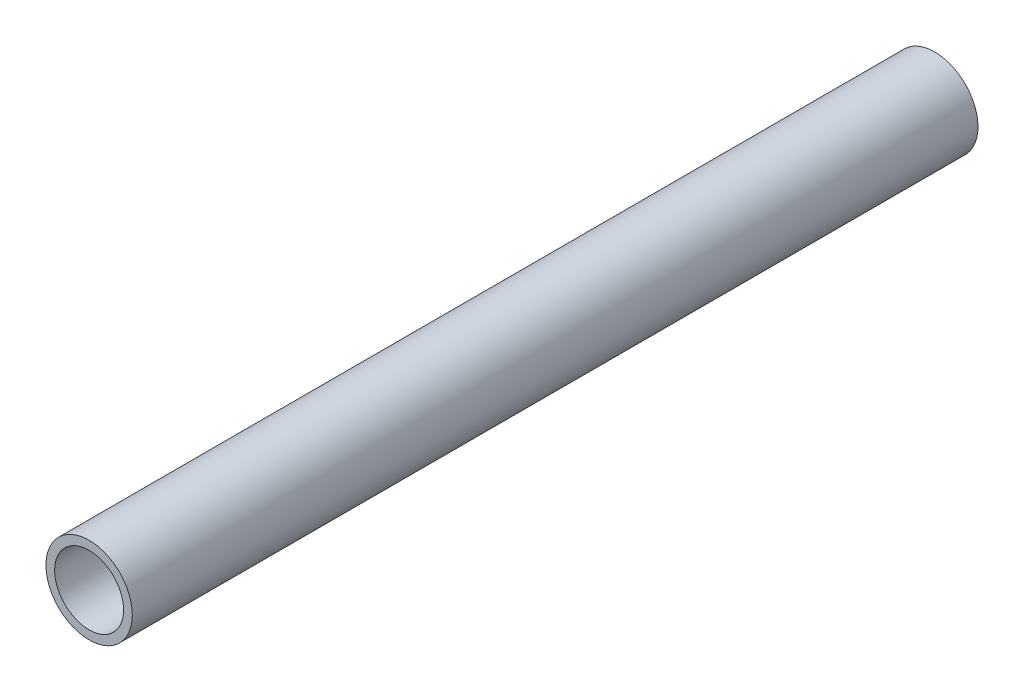
ISO-10303-21;
HEADER;
FILE_DESCRIPTION(('STEP AP214'),'2;1');
FILE_NAME('part.step','',(''),(''),'','','');
FILE_SCHEMA(('AUTOMOTIVE_DESIGN { 1 0 10303 214 1 1 1 1 }'));
ENDSEC;
DATA;
#1=APPLICATION_CONTEXT('core data for automotive mechanical design processes');
#2=APPLICATION_PROTOCOL_DEFINITION('international standard','automotive_design',2000,#1);
#3=PRODUCT_CONTEXT('',#1,'mechanical');
#4=PRODUCT('Part','Part','',(#3));
#5=PRODUCT_RELATED_PRODUCT_CATEGORY('part','',(#4));
#6=PRODUCT_DEFINITION_FORMATION('','',#4);
#7=PRODUCT_DEFINITION_CONTEXT('part definition',#1,'design');
#8=PRODUCT_DEFINITION('design','',#6,#7);
#9=PRODUCT_DEFINITION_SHAPE('','',#8);
#10=(LENGTH_UNIT() NAMED_UNIT(*) SI_UNIT(.MILLI.,.METRE.));
#11=(NAMED_UNIT(*) PLANE_ANGLE_UNIT() SI_UNIT($,.RADIAN.));
#12=(NAMED_UNIT(*) SI_UNIT($,.STERADIAN.) SOLID_ANGLE_UNIT());
#13=UNCERTAINTY_MEASURE_WITH_UNIT(LENGTH_MEASURE(1.E-05),#10,'distance_accuracy_value','');
#14=(GEOMETRIC_REPRESENTATION_CONTEXT(3) GLOBAL_UNCERTAINTY_ASSIGNED_CONTEXT((#13)) GLOBAL_UNIT_ASSIGNED_CONTEXT((#10,
#11,#12)) REPRESENTATION_CONTEXT('',''));
#15=CARTESIAN_POINT('',(0.,0.,0.));
#16=DIRECTION('',(0.,0.,1.));
#17=DIRECTION('',(1.,0.,0.));
#18=AXIS2_PLACEMENT_3D('',#15,#16,#17);
#19=CARTESIAN_POINT('',(0.,0.,163.5));
#20=DIRECTION('',(0.,0.,1.));
#21=DIRECTION('',(1.,0.,0.));
#22=AXIS2_PLACEMENT_3D('',#19,#20,#21);
#23=PLANE('',#22);
#24=CARTESIAN_POINT('',(0.,0.,163.5));
#25=DIRECTION('',(0.,0.,1.));
#26=DIRECTION('',(1.,0.,0.));
#27=AXIS2_PLACEMENT_3D('',#24,#25,#26);
#28=CIRCLE('',#27,16.7005);
#29=CARTESIAN_POINT('',(16.7005,0.,163.5));
#30=VERTEX_POINT('',#29);
#31=EDGE_CURVE('E10',#30,#30,#28,.T.);
#32=ORIENTED_EDGE('',*,*,#31,.T.);
#33=EDGE_LOOP('',(#32));
#34=FACE_BOUND('',#33,.T.);
#35=CARTESIAN_POINT('',(0.,0.,163.5));
#36=DIRECTION('',(0.,0.,1.));
#37=DIRECTION('',(1.,0.,0.));
#38=AXIS2_PLACEMENT_3D('',#35,#36,#37);
#39=CIRCLE('',#38,13.3223);
#40=CARTESIAN_POINT('',(13.3223,0.,163.5));
#41=VERTEX_POINT('',#40);
#42=EDGE_CURVE('E42',#41,#41,#39,.T.);
#43=ORIENTED_EDGE('',*,*,#42,.F.);
#44=EDGE_LOOP('',(#43));
#45=FACE_BOUND('',#44,.T.);
#46=ADVANCED_FACE('F31',(#34,#45),#23,.T.);
#47=CARTESIAN_POINT('',(0.,0.,-163.5));
#48=DIRECTION('',(0.,0.,1.));
#49=DIRECTION('',(1.,0.,0.));
#50=AXIS2_PLACEMENT_3D('',#47,#48,#49);
#51=PLANE('',#50);
#52=CARTESIAN_POINT('',(0.,0.,-163.5));
#53=DIRECTION('',(0.,0.,1.));
#54=DIRECTION('',(1.,0.,0.));
#55=AXIS2_PLACEMENT_3D('',#52,#53,#54);
#56=CIRCLE('',#55,16.7005);
#57=CARTESIAN_POINT('',(16.7005,0.,-163.5));
#58=VERTEX_POINT('',#57);
#59=EDGE_CURVE('E35',#58,#58,#56,.T.);
#60=ORIENTED_EDGE('',*,*,#59,.F.);
#61=EDGE_LOOP('',(#60));
#62=FACE_BOUND('',#61,.T.);
#63=CARTESIAN_POINT('',(0.,0.,-163.5));
#64=DIRECTION('',(0.,0.,1.));
#65=DIRECTION('',(1.,0.,0.));
#66=AXIS2_PLACEMENT_3D('',#63,#64,#65);
#67=CIRCLE('',#66,13.3223);
#68=CARTESIAN_POINT('',(13.3223,0.,-163.5));
#69=VERTEX_POINT('',#68);
#70=EDGE_CURVE('E44',#69,#69,#67,.T.);
#71=ORIENTED_EDGE('',*,*,#70,.T.);
#72=EDGE_LOOP('',(#71));
#73=FACE_BOUND('',#72,.T.);
#74=ADVANCED_FACE('F54',(#62,#73),#51,.F.);
#75=CARTESIAN_POINT('',(0.,0.,163.5));
#76=DIRECTION('',(0.,0.,-1.));
#77=DIRECTION('',(-1.,0.,0.));
#78=AXIS2_PLACEMENT_3D('',#75,#76,#77);
#79=CYLINDRICAL_SURFACE('',#78,16.7005);
#80=ORIENTED_EDGE('',*,*,#31,.F.);
#81=EDGE_LOOP('',(#80));
#82=FACE_BOUND('',#81,.T.);
#83=ORIENTED_EDGE('',*,*,#59,.T.);
#84=EDGE_LOOP('',(#83));
#85=FACE_BOUND('',#84,.T.);
#86=ADVANCED_FACE('F33',(#82,#85),#79,.T.);
#87=CARTESIAN_POINT('',(0.,0.,163.5));
#88=DIRECTION('',(0.,0.,-1.));
#89=DIRECTION('',(-1.,0.,0.));
#90=AXIS2_PLACEMENT_3D('',#87,#88,#89);
#91=CYLINDRICAL_SURFACE('',#90,13.3223);
#92=ORIENTED_EDGE('',*,*,#42,.T.);
#93=EDGE_LOOP('',(#92));
#94=FACE_BOUND('',#93,.T.);
#95=ORIENTED_EDGE('',*,*,#70,.F.);
#96=EDGE_LOOP('',(#95));
#97=FACE_BOUND('',#96,.T.);
#98=ADVANCED_FACE('F50',(#94,#97),#91,.F.);
#99=CLOSED_SHELL('',(#46,#74,#86,#98));
#100=MANIFOLD_SOLID_BREP('B2',#99);
#101=ADVANCED_BREP_SHAPE_REPRESENTATION('',(#18,#100),#14);
#102=SHAPE_DEFINITION_REPRESENTATION(#9,#101);
ENDSEC;
END-ISO-10303-21;
